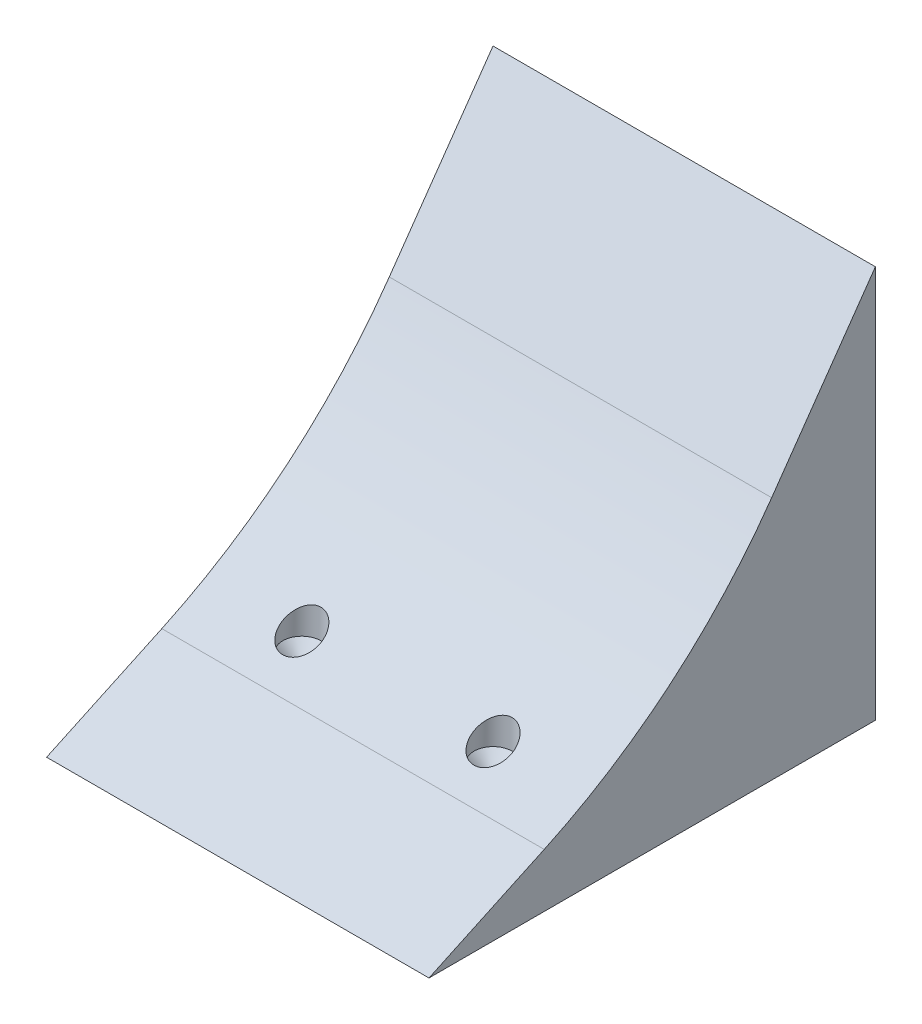
ISO-10303-21;
HEADER;
FILE_DESCRIPTION(('STEP AP214'),'2;1');
FILE_NAME('part.step','',(''),(''),'','','');
FILE_SCHEMA(('AUTOMOTIVE_DESIGN { 1 0 10303 214 1 1 1 1 }'));
ENDSEC;
DATA;
#1=APPLICATION_CONTEXT('core data for automotive mechanical design processes');
#2=APPLICATION_PROTOCOL_DEFINITION('international standard','automotive_design',2000,#1);
#3=PRODUCT_CONTEXT('',#1,'mechanical');
#4=PRODUCT('Part','Part','',(#3));
#5=PRODUCT_RELATED_PRODUCT_CATEGORY('part','',(#4));
#6=PRODUCT_DEFINITION_FORMATION('','',#4);
#7=PRODUCT_DEFINITION_CONTEXT('part definition',#1,'design');
#8=PRODUCT_DEFINITION('design','',#6,#7);
#9=PRODUCT_DEFINITION_SHAPE('','',#8);
#10=(LENGTH_UNIT() NAMED_UNIT(*) SI_UNIT(.MILLI.,.METRE.));
#11=(NAMED_UNIT(*) PLANE_ANGLE_UNIT() SI_UNIT($,.RADIAN.));
#12=(NAMED_UNIT(*) SI_UNIT($,.STERADIAN.) SOLID_ANGLE_UNIT());
#13=UNCERTAINTY_MEASURE_WITH_UNIT(LENGTH_MEASURE(1.E-05),#10,'distance_accuracy_value','');
#14=(GEOMETRIC_REPRESENTATION_CONTEXT(3) GLOBAL_UNCERTAINTY_ASSIGNED_CONTEXT((#13)) GLOBAL_UNIT_ASSIGNED_CONTEXT((#10,
#11,#12)) REPRESENTATION_CONTEXT('',''));
#15=CARTESIAN_POINT('',(0.,0.,0.));
#16=DIRECTION('',(0.,0.,1.));
#17=DIRECTION('',(1.,0.,0.));
#18=AXIS2_PLACEMENT_3D('',#15,#16,#17);
#19=CARTESIAN_POINT('',(101.6,28.0847994332052,95.2759098807705));
#20=DIRECTION('',(-1.,0.,0.));
#21=DIRECTION('',(0.,0.,1.));
#22=AXIS2_PLACEMENT_3D('',#19,#20,#21);
#23=CYLINDRICAL_SURFACE('',#22,152.4);
#24=CARTESIAN_POINT('',(25.4,-100.831148377762,13.9959098807705));
#25=CARTESIAN_POINT('',(25.527095889129,-100.831146925053,13.9959077338625));
#26=CARTESIAN_POINT('',(25.654168337019,-100.834158644722,14.0006838358532));
#27=CARTESIAN_POINT('',(25.9073590694925,-100.846155104622,14.0197156893053));
#28=CARTESIAN_POINT('',(26.0334771112958,-100.855141316184,14.0339737758832));
#29=CARTESIAN_POINT('',(26.283836827044,-100.878956948277,14.0717841490509));
#30=CARTESIAN_POINT('',(26.4080771234869,-100.893790461031,14.0953429447426));
#31=CARTESIAN_POINT('',(26.6537452936141,-100.929081379971,14.1514397468149));
#32=CARTESIAN_POINT('',(26.7751720152792,-100.949541047161,14.183981363177));
#33=CARTESIAN_POINT('',(27.0138567866955,-100.995694177725,14.25746728632));
#34=CARTESIAN_POINT('',(27.131130177653,-101.021365341579,14.2983757973141));
#35=CARTESIAN_POINT('',(27.3613661964323,-101.077653533963,14.3881879959891));
#36=CARTESIAN_POINT('',(27.4743271719837,-101.108272435132,14.4370947109454));
#37=CARTESIAN_POINT('',(27.8057171021053,-101.20697879356,14.5949859622279));
#38=CARTESIAN_POINT('',(28.0168808773068,-101.281960831124,14.715212926599));
#39=CARTESIAN_POINT('',(28.4280461076282,-101.452118847568,14.9890848863961));
#40=CARTESIAN_POINT('',(28.6265732442734,-101.548249939235,15.14432490556));
#41=CARTESIAN_POINT('',(28.994979443251,-101.753968029832,15.478084589699));
#42=CARTESIAN_POINT('',(29.1648463452128,-101.863560706527,15.6566140795798));
#43=CARTESIAN_POINT('',(29.4972552974629,-102.109801400589,16.0598164901569));
#44=CARTESIAN_POINT('',(29.6550534750942,-102.248058683302,16.287415042392));
#45=CARTESIAN_POINT('',(29.9300247530824,-102.533711225513,16.7606805266267));
#46=CARTESIAN_POINT('',(30.0471738840227,-102.681111816346,17.0063580160561));
#47=CARTESIAN_POINT('',(30.253604500292,-103.002199985407,17.545158059831));
#48=CARTESIAN_POINT('',(30.3367895530178,-103.17670334522,17.8401426625707));
#49=CARTESIAN_POINT('',(30.4491095191719,-103.52807821422,18.4388664160297));
#50=CARTESIAN_POINT('',(30.4782182043303,-103.704950830685,18.7426097424387));
#51=CARTESIAN_POINT('',(30.4817500527579,-104.070335474302,19.3751645021489));
#52=CARTESIAN_POINT('',(30.4518190194479,-104.25870270854,19.704115917925));
#53=CARTESIAN_POINT('',(30.3587965782812,-104.535346963207,20.1913434883379));
#54=CARTESIAN_POINT('',(30.3197252867779,-104.626637140789,20.3528267474143));
#55=CARTESIAN_POINT('',(30.2254602980328,-104.806594348569,20.6724853068499));
#56=CARTESIAN_POINT('',(30.1702744096019,-104.895262626422,20.8306621697331));
#57=CARTESIAN_POINT('',(30.0449888107755,-105.067586834879,21.139328429104));
#58=CARTESIAN_POINT('',(29.9751965952473,-105.15130639171,21.289907190589));
#59=CARTESIAN_POINT('',(29.8202071069377,-105.314788478739,21.5850801784497));
#60=CARTESIAN_POINT('',(29.735017451534,-105.394552940836,21.7296773207611));
#61=CARTESIAN_POINT('',(29.5494269040788,-105.549393350824,22.0114003504996));
#62=CARTESIAN_POINT('',(29.449029104856,-105.624470247636,22.1485277493315));
#63=CARTESIAN_POINT('',(29.2333784312333,-105.769151867417,22.4136938278648));
#64=CARTESIAN_POINT('',(29.1181277316201,-105.838757389117,22.5417338339095));
#65=CARTESIAN_POINT('',(28.8861977308859,-105.96470071235,22.7741366949434));
#66=CARTESIAN_POINT('',(28.7709345661399,-106.021664458877,22.87957457072));
#67=CARTESIAN_POINT('',(28.5295906201687,-106.129935819531,23.0804954625161));
#68=CARTESIAN_POINT('',(28.4035117424651,-106.181244425322,23.1759802237175));
#69=CARTESIAN_POINT('',(28.1414436089878,-106.277566746852,23.3556419242981));
#70=CARTESIAN_POINT('',(28.0054625785913,-106.322585598551,23.4398280874186));
#71=CARTESIAN_POINT('',(27.7245476747473,-106.405787411191,23.5957183080165));
#72=CARTESIAN_POINT('',(27.5796152363313,-106.443971464036,23.6674243592232));
#73=CARTESIAN_POINT('',(27.3020255813397,-106.508341667286,23.7884954641284));
#74=CARTESIAN_POINT('',(27.170323284551,-106.535449730123,23.8395663502029));
#75=CARTESIAN_POINT('',(26.9021600334595,-106.583823762432,23.930800751528));
#76=CARTESIAN_POINT('',(26.7656997623001,-106.605090566723,23.9709658254027));
#77=CARTESIAN_POINT('',(26.489194681394,-106.641516335707,24.0398139866264));
#78=CARTESIAN_POINT('',(26.3491518965172,-106.65667867298,24.068503413954));
#79=CARTESIAN_POINT('',(26.0666197076415,-106.680719699487,24.1140133385176));
#80=CARTESIAN_POINT('',(25.9241304692016,-106.689598812222,24.1308346356881));
#81=CARTESIAN_POINT('',(25.6517832283342,-106.700412191532,24.1513231133066));
#82=CARTESIAN_POINT('',(25.5220305883379,-106.702933028113,24.1561012735256));
#83=CARTESIAN_POINT('',(25.2624996487246,-106.702724851373,24.1557067107785));
#84=CARTESIAN_POINT('',(25.1327213540076,-106.699994174033,24.1505308337279));
#85=CARTESIAN_POINT('',(24.8742310494174,-106.689311550241,24.1302906315561));
#86=CARTESIAN_POINT('',(24.7455184768466,-106.681362564196,24.1152319130863));
#87=CARTESIAN_POINT('',(24.4899831888008,-106.660327697537,24.0754097397805));
#88=CARTESIAN_POINT('',(24.3631611949375,-106.647239905102,24.0506426730921));
#89=CARTESIAN_POINT('',(24.1152512561247,-106.616421918236,23.9923772382394));
#90=CARTESIAN_POINT('',(23.9940985312823,-106.598806076068,23.9590940218814));
#91=CARTESIAN_POINT('',(23.7552567389438,-106.558971301633,23.8839159013728));
#92=CARTESIAN_POINT('',(23.637568906134,-106.536750750657,23.8420179689005));
#93=CARTESIAN_POINT('',(23.2908674990325,-106.463481257388,23.7040504872464));
#94=CARTESIAN_POINT('',(23.0680007216941,-106.405797400563,23.5956558812597));
#95=CARTESIAN_POINT('',(22.6336154914208,-106.271562491855,23.3443509910213));
#96=CARTESIAN_POINT('',(22.4231669832966,-106.194233957897,23.200025085687));
#97=CARTESIAN_POINT('',(22.0296324690722,-106.024762347907,22.8851826802097));
#98=CARTESIAN_POINT('',(21.8465560283506,-105.932614116259,22.7146570663916));
#99=CARTESIAN_POINT('',(21.4935608707029,-105.726240562584,22.3347233176461));
#100=CARTESIAN_POINT('',(21.3267427347128,-105.610732472161,22.1231367592106));
#101=CARTESIAN_POINT('',(21.0308324072346,-105.367978027089,21.6812101002625));
#102=CARTESIAN_POINT('',(20.9017575556856,-105.240726312418,21.4508614420443));
#103=CARTESIAN_POINT('',(20.668659404381,-104.961374984458,20.9484747320168));
#104=CARTESIAN_POINT('',(20.5695871559883,-104.808135072699,20.6747723526757));
#105=CARTESIAN_POINT('',(20.4197888419949,-104.494329803347,20.1184971604444));
#106=CARTESIAN_POINT('',(20.3690864580135,-104.33376089779,19.8359200724041));
#107=CARTESIAN_POINT('',(20.312795382673,-103.991397013284,19.2379646288701));
#108=CARTESIAN_POINT('',(20.3126184631802,-103.809170164582,18.9223137988873));
#109=CARTESIAN_POINT('',(20.3703313474237,-103.44477642041,18.296288093648));
#110=CARTESIAN_POINT('',(20.4282459760731,-103.262609583877,17.9859155316789));
#111=CARTESIAN_POINT('',(20.6057426696881,-102.894687698444,17.3639719327081));
#112=CARTESIAN_POINT('',(20.7280940284502,-102.709166135186,17.053029612108));
#113=CARTESIAN_POINT('',(20.9580612678788,-102.44001769135,16.6053126686959));
#114=CARTESIAN_POINT('',(21.0425404640378,-102.351759093106,16.4590838527897));
#115=CARTESIAN_POINT('',(21.2268441514676,-102.17919264564,16.1742033854583));
#116=CARTESIAN_POINT('',(21.326659833985,-102.094882564568,16.0355474460092));
#117=CARTESIAN_POINT('',(21.5357955240347,-101.935470541522,15.7742644671224));
#118=CARTESIAN_POINT('',(21.6443517984416,-101.860117759509,15.6511788824258));
#119=CARTESIAN_POINT('',(21.8746159565168,-101.714847119835,15.4145863020849));
#120=CARTESIAN_POINT('',(21.9963158803209,-101.644926016347,15.3010735824261));
#121=CARTESIAN_POINT('',(22.2522132264698,-101.511592789354,15.0851921628838));
#122=CARTESIAN_POINT('',(22.3863944909175,-101.44817246784,14.9828094170838));
#123=CARTESIAN_POINT('',(22.6665700638313,-101.328852173077,14.7906343912239));
#124=CARTESIAN_POINT('',(22.8125592330218,-101.272948955992,14.7008366796625));
#125=CARTESIAN_POINT('',(23.0724696871111,-101.184346841174,14.5587944660248));
#126=CARTESIAN_POINT('',(23.1838110467079,-101.149552198523,14.5031045325393));
#127=CARTESIAN_POINT('',(23.4114509556421,-101.084815110437,14.3996191447956));
#128=CARTESIAN_POINT('',(23.5277483769181,-101.054871568202,14.3518219060088));
#129=CARTESIAN_POINT('',(23.7644833422491,-101.000261020421,14.2647389841772));
#130=CARTESIAN_POINT('',(23.8849142053123,-100.975585926156,14.2254402520517));
#131=CARTESIAN_POINT('',(24.1292828592441,-100.93180350236,14.155765301408));
#132=CARTESIAN_POINT('',(24.2532198539525,-100.912694919765,14.1253870748016));
#133=CARTESIAN_POINT('',(24.5455083190916,-100.874937058407,14.0653931109467));
#134=CARTESIAN_POINT('',(24.7149161589382,-100.858556338521,14.0393946061975));
#135=CARTESIAN_POINT('',(25.056229994743,-100.836662015205,14.0046529100892));
#136=CARTESIAN_POINT('',(25.2281364290025,-100.831150342167,13.9959127838957));
#137=CARTESIAN_POINT('',(25.4,-100.831148377762,13.9959098807705));
#138=B_SPLINE_CURVE_WITH_KNOTS('',3,(#24,#25,#26,#27,#28,#29,#30,#31,#32,#33,#34,#35,#36,#37,
#38,#39,#40,#41,#42,#43,#44,#45,#46,#47,#48,#49,#50,#51,#52,#53,#54,#55,#56,#57,#58,#59,#60,#61,
#62,#63,#64,#65,#66,#67,#68,#69,#70,#71,#72,#73,#74,#75,#76,#77,#78,#79,#80,#81,#82,#83,#84,#85,
#86,#87,#88,#89,#90,#91,#92,#93,#94,#95,#96,#97,#98,#99,#100,#101,#102,#103,#104,#105,#106,#107,
#108,#109,#110,#111,#112,#113,#114,#115,#116,#117,#118,#119,#120,#121,#122,#123,#124,#125,#126,
#127,#128,#129,#130,#131,#132,#133,#134,#135,#136,#137),.UNSPECIFIED.,.T.,.F.,(4,2,2,2,2,2,2,2,
2,2,2,2,2,2,2,2,2,2,2,2,2,2,2,2,2,2,2,2,2,2,2,2,2,2,2,2,2,2,2,2,2,2,2,2,2,2,2,2,2,2,2,2,2,2,2,2,
4),(0.,0.381122593250436,0.76233907985687,1.14382283515143,1.52546012342961,1.90549759438693,
2.28567924172155,3.04532221084819,3.85146114313089,4.65794125997346,5.58292416915991,
6.5084515873642,7.56200460978077,8.6160684961338,9.75077544998315,10.3188994645731,
10.8867486332169,11.4436682393201,12.0003130781339,12.5568448655749,13.1132952570846,
13.6114162539816,14.1094497627562,14.6070741903823,15.1046190481407,15.5355417520118,
15.9664028373151,16.3970255538611,16.8276192428423,17.2167366037732,17.605977282631,
17.9949973313668,18.384162247033,18.7643278862046,19.1446273937659,19.9045652911706,
20.701252021411,21.4982165124507,22.3741390922668,23.2504634565845,24.2332900054288,
25.2165974941665,26.3051911842383,27.3942502735422,28.53447301402,29.1054689836457,
29.6761382102972,30.217143927625,30.7578238269598,31.2978132724979,31.8375689446993,
32.2249694724501,32.6122822891201,32.9989961137966,33.3856228187686,33.9008988055478,
34.4162662994357),.UNSPECIFIED.);
#139=CARTESIAN_POINT('',(25.4,-100.831148377762,13.9959098807705));
#140=VERTEX_POINT('',#139);
#141=EDGE_CURVE('E163',#140,#140,#138,.T.);
#142=ORIENTED_EDGE('',*,*,#141,.T.);
#143=EDGE_LOOP('',(#142));
#144=FACE_BOUND('',#143,.T.);
#145=CARTESIAN_POINT('',(76.2,-100.831148377762,13.9959098807705));
#146=CARTESIAN_POINT('',(76.327095889129,-100.831146925053,13.9959077338625));
#147=CARTESIAN_POINT('',(76.454168337019,-100.834158644722,14.0006838358532));
#148=CARTESIAN_POINT('',(76.7073590694925,-100.846155104622,14.0197156893053));
#149=CARTESIAN_POINT('',(76.8334771112958,-100.855141316184,14.0339737758832));
#150=CARTESIAN_POINT('',(77.083836827044,-100.878956948277,14.0717841490509));
#151=CARTESIAN_POINT('',(77.2080771234869,-100.893790461031,14.0953429447426));
#152=CARTESIAN_POINT('',(77.4537452936141,-100.929081379971,14.1514397468149));
#153=CARTESIAN_POINT('',(77.5751720152792,-100.94954104716,14.1839813631769));
#154=CARTESIAN_POINT('',(77.8138567866955,-100.995694177725,14.25746728632));
#155=CARTESIAN_POINT('',(77.931130177653,-101.021365341579,14.2983757973141));
#156=CARTESIAN_POINT('',(78.1613661964323,-101.077653533963,14.3881879959891));
#157=CARTESIAN_POINT('',(78.2743271719837,-101.108272435132,14.4370947109454));
#158=CARTESIAN_POINT('',(78.6057171021053,-101.206978793559,14.5949859622279));
#159=CARTESIAN_POINT('',(78.8168808773068,-101.281960831124,14.7152129265991));
#160=CARTESIAN_POINT('',(79.2280461076282,-101.452118847568,14.9890848863961));
#161=CARTESIAN_POINT('',(79.4265732442734,-101.548249939235,15.14432490556));
#162=CARTESIAN_POINT('',(79.794979443251,-101.753968029832,15.478084589699));
#163=CARTESIAN_POINT('',(79.9648463452128,-101.863560706527,15.6566140795798));
#164=CARTESIAN_POINT('',(80.2972552974629,-102.109801400589,16.0598164901569));
#165=CARTESIAN_POINT('',(80.4550534750942,-102.248058683302,16.287415042392));
#166=CARTESIAN_POINT('',(80.7300247530824,-102.533711225513,16.7606805266267));
#167=CARTESIAN_POINT('',(80.8471738840227,-102.681111816346,17.0063580160561));
#168=CARTESIAN_POINT('',(81.053604500292,-103.002199985407,17.545158059831));
#169=CARTESIAN_POINT('',(81.1367895530178,-103.17670334522,17.8401426625707));
#170=CARTESIAN_POINT('',(81.2491095191719,-103.52807821422,18.4388664160298));
#171=CARTESIAN_POINT('',(81.2782182043303,-103.704950830685,18.7426097424387));
#172=CARTESIAN_POINT('',(81.2817500527579,-104.070335474302,19.3751645021489));
#173=CARTESIAN_POINT('',(81.2518190194479,-104.25870270854,19.704115917925));
#174=CARTESIAN_POINT('',(81.1587965782812,-104.535346963207,20.1913434883379));
#175=CARTESIAN_POINT('',(81.1197252867779,-104.626637140789,20.3528267474144));
#176=CARTESIAN_POINT('',(81.0254602980328,-104.806594348569,20.6724853068499));
#177=CARTESIAN_POINT('',(80.9702744096019,-104.895262626422,20.8306621697331));
#178=CARTESIAN_POINT('',(80.8449888107755,-105.067586834879,21.139328429104));
#179=CARTESIAN_POINT('',(80.7751965952473,-105.15130639171,21.289907190589));
#180=CARTESIAN_POINT('',(80.6202071069377,-105.314788478739,21.5850801784497));
#181=CARTESIAN_POINT('',(80.535017451534,-105.394552940836,21.729677320761));
#182=CARTESIAN_POINT('',(80.3494269040788,-105.549393350824,22.0114003504996));
#183=CARTESIAN_POINT('',(80.249029104856,-105.624470247636,22.1485277493315));
#184=CARTESIAN_POINT('',(80.0333784312333,-105.769151867417,22.4136938278648));
#185=CARTESIAN_POINT('',(79.9181277316201,-105.838757389117,22.5417338339095));
#186=CARTESIAN_POINT('',(79.6861977308859,-105.96470071235,22.7741366949434));
#187=CARTESIAN_POINT('',(79.5709345661399,-106.021664458877,22.87957457072));
#188=CARTESIAN_POINT('',(79.3295906201687,-106.129935819531,23.0804954625161));
#189=CARTESIAN_POINT('',(79.2035117424651,-106.181244425322,23.1759802237175));
#190=CARTESIAN_POINT('',(78.9414436089878,-106.277566746852,23.3556419242981));
#191=CARTESIAN_POINT('',(78.8054625785913,-106.322585598551,23.4398280874186));
#192=CARTESIAN_POINT('',(78.5245476747473,-106.405787411191,23.5957183080165));
#193=CARTESIAN_POINT('',(78.3796152363312,-106.443971464036,23.6674243592232));
#194=CARTESIAN_POINT('',(78.1020255813397,-106.508341667286,23.7884954641284));
#195=CARTESIAN_POINT('',(77.970323284551,-106.535449730123,23.839566350203));
#196=CARTESIAN_POINT('',(77.7021600334594,-106.583823762432,23.930800751528));
#197=CARTESIAN_POINT('',(77.5656997623001,-106.605090566723,23.9709658254027));
#198=CARTESIAN_POINT('',(77.289194681394,-106.641516335707,24.0398139866264));
#199=CARTESIAN_POINT('',(77.1491518965172,-106.65667867298,24.068503413954));
#200=CARTESIAN_POINT('',(76.8666197076415,-106.680719699487,24.1140133385176));
#201=CARTESIAN_POINT('',(76.7241304692015,-106.689598812222,24.1308346356881));
#202=CARTESIAN_POINT('',(76.4517832283342,-106.700412191532,24.1513231133066));
#203=CARTESIAN_POINT('',(76.3220305883379,-106.702933028113,24.1561012735256));
#204=CARTESIAN_POINT('',(76.0624996487246,-106.702724851373,24.1557067107785));
#205=CARTESIAN_POINT('',(75.9327213540076,-106.699994174033,24.1505308337279));
#206=CARTESIAN_POINT('',(75.6742310494174,-106.689311550241,24.1302906315561));
#207=CARTESIAN_POINT('',(75.5455184768466,-106.681362564196,24.1152319130863));
#208=CARTESIAN_POINT('',(75.2899831888008,-106.660327697537,24.0754097397805));
#209=CARTESIAN_POINT('',(75.1631611949374,-106.647239905102,24.0506426730921));
#210=CARTESIAN_POINT('',(74.9152512561247,-106.616421918236,23.9923772382394));
#211=CARTESIAN_POINT('',(74.7940985312823,-106.598806076068,23.9590940218814));
#212=CARTESIAN_POINT('',(74.5552567389438,-106.558971301633,23.8839159013728));
#213=CARTESIAN_POINT('',(74.437568906134,-106.536750750657,23.8420179689005));
#214=CARTESIAN_POINT('',(74.0908674990325,-106.463481257388,23.7040504872464));
#215=CARTESIAN_POINT('',(73.8680007216941,-106.405797400563,23.5956558812597));
#216=CARTESIAN_POINT('',(73.4336154914208,-106.271562491855,23.3443509910213));
#217=CARTESIAN_POINT('',(73.2231669832966,-106.194233957897,23.200025085687));
#218=CARTESIAN_POINT('',(72.8296324690722,-106.024762347907,22.8851826802097));
#219=CARTESIAN_POINT('',(72.6465560283506,-105.932614116259,22.7146570663916));
#220=CARTESIAN_POINT('',(72.2935608707029,-105.726240562584,22.3347233176461));
#221=CARTESIAN_POINT('',(72.1267427347128,-105.610732472161,22.1231367592106));
#222=CARTESIAN_POINT('',(71.8308324072346,-105.367978027089,21.6812101002625));
#223=CARTESIAN_POINT('',(71.7017575556856,-105.240726312418,21.4508614420443));
#224=CARTESIAN_POINT('',(71.468659404381,-104.961374984458,20.9484747320168));
#225=CARTESIAN_POINT('',(71.3695871559883,-104.808135072699,20.6747723526757));
#226=CARTESIAN_POINT('',(71.2197888419949,-104.494329803347,20.1184971604443));
#227=CARTESIAN_POINT('',(71.1690864580135,-104.33376089779,19.8359200724041));
#228=CARTESIAN_POINT('',(71.112795382673,-103.991397013284,19.2379646288701));
#229=CARTESIAN_POINT('',(71.1126184631802,-103.809170164582,18.9223137988873));
#230=CARTESIAN_POINT('',(71.1703313474237,-103.44477642041,18.296288093648));
#231=CARTESIAN_POINT('',(71.2282459760731,-103.262609583877,17.9859155316789));
#232=CARTESIAN_POINT('',(71.4057426696881,-102.894687698444,17.3639719327081));
#233=CARTESIAN_POINT('',(71.5280940284502,-102.709166135186,17.053029612108));
#234=CARTESIAN_POINT('',(71.7580612678788,-102.44001769135,16.6053126686959));
#235=CARTESIAN_POINT('',(71.8425404640378,-102.351759093106,16.4590838527897));
#236=CARTESIAN_POINT('',(72.0268441514676,-102.17919264564,16.1742033854583));
#237=CARTESIAN_POINT('',(72.126659833985,-102.094882564568,16.0355474460092));
#238=CARTESIAN_POINT('',(72.3357955240347,-101.935470541522,15.7742644671224));
#239=CARTESIAN_POINT('',(72.4443517984416,-101.860117759509,15.6511788824258));
#240=CARTESIAN_POINT('',(72.6746159565168,-101.714847119835,15.4145863020849));
#241=CARTESIAN_POINT('',(72.7963158803209,-101.644926016347,15.3010735824261));
#242=CARTESIAN_POINT('',(73.0522132264698,-101.511592789354,15.0851921628838));
#243=CARTESIAN_POINT('',(73.1863944909175,-101.44817246784,14.9828094170838));
#244=CARTESIAN_POINT('',(73.4665700638313,-101.328852173077,14.7906343912239));
#245=CARTESIAN_POINT('',(73.6125592330218,-101.272948955992,14.7008366796625));
#246=CARTESIAN_POINT('',(73.8724696871111,-101.184346841174,14.5587944660248));
#247=CARTESIAN_POINT('',(73.9838110467079,-101.149552198523,14.5031045325393));
#248=CARTESIAN_POINT('',(74.2114509556421,-101.084815110437,14.3996191447956));
#249=CARTESIAN_POINT('',(74.327748376918,-101.054871568202,14.3518219060088));
#250=CARTESIAN_POINT('',(74.5644833422491,-101.000261020421,14.2647389841772));
#251=CARTESIAN_POINT('',(74.6849142053123,-100.975585926156,14.2254402520517));
#252=CARTESIAN_POINT('',(74.9292828592441,-100.93180350236,14.155765301408));
#253=CARTESIAN_POINT('',(75.0532198539525,-100.912694919765,14.1253870748016));
#254=CARTESIAN_POINT('',(75.3455083190916,-100.874937058407,14.0653931109467));
#255=CARTESIAN_POINT('',(75.5149161589382,-100.858556338521,14.0393946061975));
#256=CARTESIAN_POINT('',(75.856229994743,-100.836662015205,14.0046529100892));
#257=CARTESIAN_POINT('',(76.0281364290025,-100.831150342167,13.9959127838957));
#258=CARTESIAN_POINT('',(76.2,-100.831148377762,13.9959098807705));
#259=B_SPLINE_CURVE_WITH_KNOTS('',3,(#145,#146,#147,#148,#149,#150,#151,#152,#153,#154,#155,
#156,#157,#158,#159,#160,#161,#162,#163,#164,#165,#166,#167,#168,#169,#170,#171,#172,#173,#174,
#175,#176,#177,#178,#179,#180,#181,#182,#183,#184,#185,#186,#187,#188,#189,#190,#191,#192,#193,
#194,#195,#196,#197,#198,#199,#200,#201,#202,#203,#204,#205,#206,#207,#208,#209,#210,#211,#212,
#213,#214,#215,#216,#217,#218,#219,#220,#221,#222,#223,#224,#225,#226,#227,#228,#229,#230,#231,
#232,#233,#234,#235,#236,#237,#238,#239,#240,#241,#242,#243,#244,#245,#246,#247,#248,#249,#250,
#251,#252,#253,#254,#255,#256,#257,#258),.UNSPECIFIED.,.T.,.F.,(4,2,2,2,2,2,2,2,2,2,2,2,2,2,2,2,
2,2,2,2,2,2,2,2,2,2,2,2,2,2,2,2,2,2,2,2,2,2,2,2,2,2,2,2,2,2,2,2,2,2,2,2,2,2,2,2,4),(0.,
0.381122593250446,0.762339079856873,1.14382283515142,1.52546012342961,1.90549759438695,
2.28567924172159,3.0453222108482,3.8514611431309,4.65794125997345,5.58292416915991,
6.50845158736421,7.56200460978078,8.6160684961338,9.75077544998317,10.3188994645731,
10.886748633217,11.4436682393201,12.0003130781339,12.5568448655749,13.1132952570846,
13.6114162539816,14.1094497627562,14.6070741903823,15.1046190481408,15.5355417520118,
15.9664028373151,16.3970255538611,16.8276192428423,17.2167366037732,17.605977282631,
17.9949973313668,18.384162247033,18.7643278862046,19.144627393766,19.9045652911706,
20.701252021411,21.4982165124508,22.3741390922668,23.2504634565845,24.2332900054289,
25.2165974941665,26.3051911842383,27.3942502735422,28.5344730140201,29.1054689836457,
29.6761382102972,30.217143927625,30.7578238269598,31.297813272498,31.8375689446993,
32.2249694724501,32.6122822891201,32.9989961137966,33.3856228187687,33.9008988055478,
34.4162662994357),.UNSPECIFIED.);
#260=CARTESIAN_POINT('',(76.2,-100.831148377762,13.9959098807705));
#261=VERTEX_POINT('',#260);
#262=EDGE_CURVE('E154',#261,#261,#259,.T.);
#263=ORIENTED_EDGE('',*,*,#262,.T.);
#264=EDGE_LOOP('',(#263));
#265=FACE_BOUND('',#264,.T.);
#266=CARTESIAN_POINT('',(0.,28.0847994332052,95.2759098807705));
#267=DIRECTION('',(-1.,0.,0.));
#268=DIRECTION('',(0.,0.,-1.));
#269=AXIS2_PLACEMENT_3D('',#266,#267,#268);
#270=CIRCLE('',#269,152.4);
#271=CARTESIAN_POINT('',(0.,-59.3282494666939,-29.5628616688721));
#272=VERTEX_POINT('',#271);
#273=CARTESIAN_POINT('',(0.,-110.036507311181,30.8688867914888));
#274=VERTEX_POINT('',#273);
#275=EDGE_CURVE('E121',#272,#274,#270,.T.);
#276=ORIENTED_EDGE('',*,*,#275,.T.);
#277=DIRECTION('',(-1.,0.,0.));
#278=VECTOR('',#277,1.);
#279=CARTESIAN_POINT('',(101.6,-110.036507311181,30.8688867914888));
#280=LINE('',#279,#278);
#281=CARTESIAN_POINT('',(101.6,-110.036507311181,30.8688867914888));
#282=VERTEX_POINT('',#281);
#283=EDGE_CURVE('E142',#282,#274,#280,.T.);
#284=ORIENTED_EDGE('',*,*,#283,.F.);
#285=CARTESIAN_POINT('',(101.6,28.0847994332052,95.2759098807705));
#286=DIRECTION('',(-1.,0.,0.));
#287=DIRECTION('',(0.,0.,-1.));
#288=AXIS2_PLACEMENT_3D('',#285,#286,#287);
#289=CIRCLE('',#288,152.4);
#290=CARTESIAN_POINT('',(101.6,-59.3282494666939,-29.5628616688721));
#291=VERTEX_POINT('',#290);
#292=EDGE_CURVE('E135',#291,#282,#289,.T.);
#293=ORIENTED_EDGE('',*,*,#292,.F.);
#294=DIRECTION('',(-1.,0.,0.));
#295=VECTOR('',#294,1.);
#296=CARTESIAN_POINT('',(101.6,-59.3282494666939,-29.5628616688721));
#297=LINE('',#296,#295);
#298=EDGE_CURVE('E117',#291,#272,#297,.T.);
#299=ORIENTED_EDGE('',*,*,#298,.T.);
#300=EDGE_LOOP('',(#276,#284,#293,#299));
#301=FACE_BOUND('',#300,.T.);
#302=ADVANCED_FACE('F39',(#144,#265,#301),#23,.F.);
#303=CARTESIAN_POINT('',(101.6,-110.036507311181,30.8688867914888));
#304=DIRECTION('',(0.,-0.906307787036653,-0.422618261740694));
#305=DIRECTION('',(0.,0.422618261740694,-0.906307787036653));
#306=AXIS2_PLACEMENT_3D('',#303,#304,#305);
#307=PLANE('',#306);
#308=DIRECTION('',(0.,-0.422618261740694,0.906307787036653));
#309=VECTOR('',#308,1.);
#310=CARTESIAN_POINT('',(0.,-110.036507311181,30.8688867914888));
#311=LINE('',#310,#309);
#312=CARTESIAN_POINT('',(0.,-124.315200566795,61.489643293987));
#313=VERTEX_POINT('',#312);
#314=EDGE_CURVE('E125',#274,#313,#311,.T.);
#315=ORIENTED_EDGE('',*,*,#314,.T.);
#316=DIRECTION('',(-1.,0.,0.));
#317=VECTOR('',#316,1.);
#318=CARTESIAN_POINT('',(101.6,-124.315200566795,61.489643293987));
#319=LINE('',#318,#317);
#320=CARTESIAN_POINT('',(101.6,-124.315200566795,61.489643293987));
#321=VERTEX_POINT('',#320);
#322=EDGE_CURVE('E110',#321,#313,#319,.T.);
#323=ORIENTED_EDGE('',*,*,#322,.F.);
#324=DIRECTION('',(0.,-0.422618261740694,0.906307787036653));
#325=VECTOR('',#324,1.);
#326=CARTESIAN_POINT('',(101.6,-110.036507311181,30.8688867914888));
#327=LINE('',#326,#325);
#328=EDGE_CURVE('E92',#282,#321,#327,.T.);
#329=ORIENTED_EDGE('',*,*,#328,.F.);
#330=ORIENTED_EDGE('',*,*,#283,.T.);
#331=EDGE_LOOP('',(#315,#323,#329,#330));
#332=FACE_BOUND('',#331,.T.);
#333=ADVANCED_FACE('F200',(#332),#307,.F.);
#334=CARTESIAN_POINT('',(101.6,-124.315200566795,61.489643293987));
#335=DIRECTION('',(0.,1.,0.));
#336=DIRECTION('',(0.,0.,1.));
#337=AXIS2_PLACEMENT_3D('',#334,#335,#336);
#338=PLANE('',#337);
#339=CARTESIAN_POINT('',(25.4,-124.315200566795,19.0759098807705));
#340=DIRECTION('',(0.,-1.,0.));
#341=DIRECTION('',(0.,0.,-1.));
#342=AXIS2_PLACEMENT_3D('',#339,#340,#341);
#343=CIRCLE('',#342,1.905);
#344=CARTESIAN_POINT('',(25.4,-124.315200566795,17.1709098807705));
#345=VERTEX_POINT('',#344);
#346=EDGE_CURVE('E126',#345,#345,#343,.T.);
#347=ORIENTED_EDGE('',*,*,#346,.F.);
#348=EDGE_LOOP('',(#347));
#349=FACE_BOUND('',#348,.T.);
#350=CARTESIAN_POINT('',(76.2,-124.315200566795,19.0759098807705));
#351=DIRECTION('',(0.,-1.,0.));
#352=DIRECTION('',(0.,0.,-1.));
#353=AXIS2_PLACEMENT_3D('',#350,#351,#352);
#354=CIRCLE('',#353,1.90500000000001);
#355=CARTESIAN_POINT('',(76.2,-124.315200566795,17.1709098807705));
#356=VERTEX_POINT('',#355);
#357=EDGE_CURVE('E215',#356,#356,#354,.T.);
#358=ORIENTED_EDGE('',*,*,#357,.F.);
#359=EDGE_LOOP('',(#358));
#360=FACE_BOUND('',#359,.T.);
#361=DIRECTION('',(0.,0.,-1.));
#362=VECTOR('',#361,1.);
#363=CARTESIAN_POINT('',(0.,-124.315200566795,61.489643293987));
#364=LINE('',#363,#362);
#365=CARTESIAN_POINT('',(0.,-124.315200566795,-57.1240901192295));
#366=VERTEX_POINT('',#365);
#367=EDGE_CURVE('E108',#313,#366,#364,.T.);
#368=ORIENTED_EDGE('',*,*,#367,.T.);
#369=DIRECTION('',(-1.,0.,0.));
#370=VECTOR('',#369,1.);
#371=CARTESIAN_POINT('',(101.6,-124.315200566795,-57.1240901192295));
#372=LINE('',#371,#370);
#373=CARTESIAN_POINT('',(101.6,-124.315200566795,-57.1240901192295));
#374=VERTEX_POINT('',#373);
#375=EDGE_CURVE('E105',#374,#366,#372,.T.);
#376=ORIENTED_EDGE('',*,*,#375,.F.);
#377=DIRECTION('',(0.,0.,-1.));
#378=VECTOR('',#377,1.);
#379=CARTESIAN_POINT('',(101.6,-124.315200566795,61.489643293987));
#380=LINE('',#379,#378);
#381=EDGE_CURVE('E96',#321,#374,#380,.T.);
#382=ORIENTED_EDGE('',*,*,#381,.F.);
#383=ORIENTED_EDGE('',*,*,#322,.T.);
#384=EDGE_LOOP('',(#368,#376,#382,#383));
#385=FACE_BOUND('',#384,.T.);
#386=ADVANCED_FACE('F106',(#349,#360,#385),#338,.F.);
#387=CARTESIAN_POINT('',(101.6,-124.315200566795,-57.1240901192295));
#388=DIRECTION('',(0.,0.,1.));
#389=DIRECTION('',(0.,-1.,0.));
#390=AXIS2_PLACEMENT_3D('',#387,#388,#389);
#391=PLANE('',#390);
#392=DIRECTION('',(0.,1.,0.));
#393=VECTOR('',#392,1.);
#394=CARTESIAN_POINT('',(0.,-124.315200566795,-57.1240901192295));
#395=LINE('',#394,#393);
#396=CARTESIAN_POINT('',(0.,-19.9667359919517,-57.1240901192295));
#397=VERTEX_POINT('',#396);
#398=EDGE_CURVE('E77',#366,#397,#395,.T.);
#399=ORIENTED_EDGE('',*,*,#398,.T.);
#400=DIRECTION('',(-1.,0.,0.));
#401=VECTOR('',#400,1.);
#402=CARTESIAN_POINT('',(101.6,-19.9667359919517,-57.1240901192295));
#403=LINE('',#402,#401);
#404=CARTESIAN_POINT('',(101.6,-19.9667359919517,-57.1240901192295));
#405=VERTEX_POINT('',#404);
#406=EDGE_CURVE('E111',#405,#397,#403,.T.);
#407=ORIENTED_EDGE('',*,*,#406,.F.);
#408=DIRECTION('',(0.,1.,0.));
#409=VECTOR('',#408,1.);
#410=CARTESIAN_POINT('',(101.6,-124.315200566795,-57.1240901192295));
#411=LINE('',#410,#409);
#412=EDGE_CURVE('E100',#374,#405,#411,.T.);
#413=ORIENTED_EDGE('',*,*,#412,.F.);
#414=ORIENTED_EDGE('',*,*,#375,.T.);
#415=EDGE_LOOP('',(#399,#407,#413,#414));
#416=FACE_BOUND('',#415,.T.);
#417=ADVANCED_FACE('F113',(#416),#391,.F.);
#418=CARTESIAN_POINT('',(101.6,-59.3282494666939,-29.5628616688721));
#419=DIRECTION('',(0.,-0.573576436351044,-0.819152044288993));
#420=DIRECTION('',(0.,0.819152044288993,-0.573576436351044));
#421=AXIS2_PLACEMENT_3D('',#418,#419,#420);
#422=PLANE('',#421);
#423=DIRECTION('',(0.,-0.819152044288993,0.573576436351044));
#424=VECTOR('',#423,1.);
#425=CARTESIAN_POINT('',(0.,-59.3282494666939,-29.5628616688721));
#426=LINE('',#425,#424);
#427=EDGE_CURVE('E83',#397,#272,#426,.T.);
#428=ORIENTED_EDGE('',*,*,#427,.T.);
#429=ORIENTED_EDGE('',*,*,#298,.F.);
#430=DIRECTION('',(0.,-0.819152044288993,0.573576436351044));
#431=VECTOR('',#430,1.);
#432=CARTESIAN_POINT('',(101.6,-59.3282494666939,-29.5628616688721));
#433=LINE('',#432,#431);
#434=EDGE_CURVE('E57',#405,#291,#433,.T.);
#435=ORIENTED_EDGE('',*,*,#434,.F.);
#436=ORIENTED_EDGE('',*,*,#406,.T.);
#437=EDGE_LOOP('',(#428,#429,#435,#436));
#438=FACE_BOUND('',#437,.T.);
#439=ADVANCED_FACE('F191',(#438),#422,.F.);
#440=CARTESIAN_POINT('',(101.6,28.0847994332052,95.2759098807705));
#441=DIRECTION('',(1.,0.,0.));
#442=DIRECTION('',(0.,0.,-1.));
#443=AXIS2_PLACEMENT_3D('',#440,#441,#442);
#444=PLANE('',#443);
#445=ORIENTED_EDGE('',*,*,#292,.T.);
#446=ORIENTED_EDGE('',*,*,#328,.T.);
#447=ORIENTED_EDGE('',*,*,#381,.T.);
#448=ORIENTED_EDGE('',*,*,#412,.T.);
#449=ORIENTED_EDGE('',*,*,#434,.T.);
#450=EDGE_LOOP('',(#445,#446,#447,#448,#449));
#451=FACE_BOUND('',#450,.T.);
#452=ADVANCED_FACE('F98',(#451),#444,.T.);
#453=CARTESIAN_POINT('',(0.,28.0847994332052,95.2759098807705));
#454=DIRECTION('',(1.,0.,0.));
#455=DIRECTION('',(0.,0.,-1.));
#456=AXIS2_PLACEMENT_3D('',#453,#454,#455);
#457=PLANE('',#456);
#458=ORIENTED_EDGE('',*,*,#275,.F.);
#459=ORIENTED_EDGE('',*,*,#427,.F.);
#460=ORIENTED_EDGE('',*,*,#398,.F.);
#461=ORIENTED_EDGE('',*,*,#367,.F.);
#462=ORIENTED_EDGE('',*,*,#314,.F.);
#463=EDGE_LOOP('',(#458,#459,#460,#461,#462));
#464=FACE_BOUND('',#463,.T.);
#465=ADVANCED_FACE('F187',(#464),#457,.F.);
#466=CARTESIAN_POINT('',(76.2,-22.7152005667948,19.0759098807705));
#467=DIRECTION('',(0.,-1.,0.));
#468=DIRECTION('',(0.,0.,-1.));
#469=AXIS2_PLACEMENT_3D('',#466,#467,#468);
#470=CYLINDRICAL_SURFACE('',#469,1.90500000000001);
#471=CARTESIAN_POINT('',(76.2,-111.615200566795,19.0759098807705));
#472=DIRECTION('',(0.,-1.,0.));
#473=DIRECTION('',(0.,0.,-1.));
#474=AXIS2_PLACEMENT_3D('',#471,#472,#473);
#475=CIRCLE('',#474,1.90500000000001);
#476=CARTESIAN_POINT('',(76.2,-111.615200566795,17.1709098807705));
#477=VERTEX_POINT('',#476);
#478=EDGE_CURVE('E150',#477,#477,#475,.F.);
#479=ORIENTED_EDGE('',*,*,#478,.T.);
#480=EDGE_LOOP('',(#479));
#481=FACE_BOUND('',#480,.T.);
#482=ORIENTED_EDGE('',*,*,#357,.T.);
#483=EDGE_LOOP('',(#482));
#484=FACE_BOUND('',#483,.T.);
#485=ADVANCED_FACE('F183',(#481,#484),#470,.F.);
#486=CARTESIAN_POINT('',(25.4,-22.7152005667948,19.0759098807705));
#487=DIRECTION('',(0.,-1.,0.));
#488=DIRECTION('',(0.,0.,-1.));
#489=AXIS2_PLACEMENT_3D('',#486,#487,#488);
#490=CYLINDRICAL_SURFACE('',#489,1.905);
#491=CARTESIAN_POINT('',(25.4,-111.615200566795,19.0759098807705));
#492=DIRECTION('',(0.,-1.,0.));
#493=DIRECTION('',(0.,0.,-1.));
#494=AXIS2_PLACEMENT_3D('',#491,#492,#493);
#495=CIRCLE('',#494,1.905);
#496=CARTESIAN_POINT('',(25.4,-111.615200566795,17.1709098807705));
#497=VERTEX_POINT('',#496);
#498=EDGE_CURVE('E146',#497,#497,#495,.F.);
#499=ORIENTED_EDGE('',*,*,#498,.T.);
#500=EDGE_LOOP('',(#499));
#501=FACE_BOUND('',#500,.T.);
#502=ORIENTED_EDGE('',*,*,#346,.T.);
#503=EDGE_LOOP('',(#502));
#504=FACE_BOUND('',#503,.T.);
#505=ADVANCED_FACE('F179',(#501,#504),#490,.F.);
#506=CARTESIAN_POINT('',(25.4,-10.0152005667948,19.0759098807705));
#507=DIRECTION('',(0.,-1.,0.));
#508=DIRECTION('',(0.,0.,-1.));
#509=AXIS2_PLACEMENT_3D('',#506,#507,#508);
#510=CYLINDRICAL_SURFACE('',#509,5.08);
#511=CARTESIAN_POINT('',(25.4,-108.567200566795,19.0759098807705));
#512=DIRECTION('',(0.,-1.,0.));
#513=DIRECTION('',(0.,0.,-1.));
#514=AXIS2_PLACEMENT_3D('',#511,#512,#513);
#515=CIRCLE('',#514,5.08);
#516=CARTESIAN_POINT('',(25.4,-108.567200566795,13.9959098807705));
#517=VERTEX_POINT('',#516);
#518=EDGE_CURVE('E49',#517,#517,#515,.T.);
#519=ORIENTED_EDGE('',*,*,#518,.T.);
#520=EDGE_LOOP('',(#519));
#521=FACE_BOUND('',#520,.T.);
#522=ORIENTED_EDGE('',*,*,#141,.F.);
#523=EDGE_LOOP('',(#522));
#524=FACE_BOUND('',#523,.T.);
#525=ADVANCED_FACE('F182',(#521,#524),#510,.F.);
#526=CARTESIAN_POINT('',(25.4,-111.615200566795,19.0759098807705));
#527=DIRECTION('',(0.,-1.,0.));
#528=DIRECTION('',(0.,0.,-1.));
#529=AXIS2_PLACEMENT_3D('',#526,#527,#528);
#530=PLANE('',#529);
#531=CARTESIAN_POINT('',(25.4,-111.615200566795,19.0759098807705));
#532=DIRECTION('',(0.,-1.,0.));
#533=DIRECTION('',(0.,0.,-1.));
#534=AXIS2_PLACEMENT_3D('',#531,#532,#533);
#535=CIRCLE('',#534,2.03200000000001);
#536=CARTESIAN_POINT('',(25.4,-111.615200566795,17.0439098807705));
#537=VERTEX_POINT('',#536);
#538=EDGE_CURVE('E11',#537,#537,#535,.F.);
#539=ORIENTED_EDGE('',*,*,#538,.T.);
#540=EDGE_LOOP('',(#539));
#541=FACE_BOUND('',#540,.T.);
#542=ORIENTED_EDGE('',*,*,#498,.F.);
#543=EDGE_LOOP('',(#542));
#544=FACE_BOUND('',#543,.T.);
#545=ADVANCED_FACE('F177',(#541,#544),#530,.F.);
#546=CARTESIAN_POINT('',(76.2,-10.0152005667948,19.0759098807705));
#547=DIRECTION('',(0.,-1.,0.));
#548=DIRECTION('',(0.,0.,-1.));
#549=AXIS2_PLACEMENT_3D('',#546,#547,#548);
#550=CYLINDRICAL_SURFACE('',#549,5.08);
#551=CARTESIAN_POINT('',(76.2,-108.567200566795,19.0759098807705));
#552=DIRECTION('',(0.,-1.,0.));
#553=DIRECTION('',(0.,0.,-1.));
#554=AXIS2_PLACEMENT_3D('',#551,#552,#553);
#555=CIRCLE('',#554,5.08);
#556=CARTESIAN_POINT('',(76.2,-108.567200566795,13.9959098807705));
#557=VERTEX_POINT('',#556);
#558=EDGE_CURVE('E145',#557,#557,#555,.T.);
#559=ORIENTED_EDGE('',*,*,#558,.T.);
#560=EDGE_LOOP('',(#559));
#561=FACE_BOUND('',#560,.T.);
#562=ORIENTED_EDGE('',*,*,#262,.F.);
#563=EDGE_LOOP('',(#562));
#564=FACE_BOUND('',#563,.T.);
#565=ADVANCED_FACE('F171',(#561,#564),#550,.F.);
#566=CARTESIAN_POINT('',(76.2,-111.615200566795,19.0759098807705));
#567=DIRECTION('',(0.,-1.,0.));
#568=DIRECTION('',(0.,0.,-1.));
#569=AXIS2_PLACEMENT_3D('',#566,#567,#568);
#570=PLANE('',#569);
#571=CARTESIAN_POINT('',(76.2,-111.615200566795,19.0759098807705));
#572=DIRECTION('',(0.,-1.,0.));
#573=DIRECTION('',(0.,0.,-1.));
#574=AXIS2_PLACEMENT_3D('',#571,#572,#573);
#575=CIRCLE('',#574,2.03200000000003);
#576=CARTESIAN_POINT('',(76.2,-111.615200566795,17.0439098807705));
#577=VERTEX_POINT('',#576);
#578=EDGE_CURVE('E243',#577,#577,#575,.F.);
#579=ORIENTED_EDGE('',*,*,#578,.T.);
#580=EDGE_LOOP('',(#579));
#581=FACE_BOUND('',#580,.T.);
#582=ORIENTED_EDGE('',*,*,#478,.F.);
#583=EDGE_LOOP('',(#582));
#584=FACE_BOUND('',#583,.T.);
#585=ADVANCED_FACE('F176',(#581,#584),#570,.F.);
#586=CARTESIAN_POINT('',(76.2,-108.567200566795,19.0759098807705));
#587=DIRECTION('',(0.,1.,0.));
#588=DIRECTION('',(0.,0.,1.));
#589=AXIS2_PLACEMENT_3D('',#586,#587,#588);
#590=CONICAL_SURFACE('',#589,5.08,0.785398163397442);
#591=ORIENTED_EDGE('',*,*,#578,.F.);
#592=EDGE_LOOP('',(#591));
#593=FACE_BOUND('',#592,.T.);
#594=ORIENTED_EDGE('',*,*,#558,.F.);
#595=EDGE_LOOP('',(#594));
#596=FACE_BOUND('',#595,.T.);
#597=ADVANCED_FACE('F252',(#593,#596),#590,.F.);
#598=CARTESIAN_POINT('',(25.4,-108.567200566795,19.0759098807705));
#599=DIRECTION('',(0.,1.,0.));
#600=DIRECTION('',(0.,0.,1.));
#601=AXIS2_PLACEMENT_3D('',#598,#599,#600);
#602=CONICAL_SURFACE('',#601,5.08,0.785398163397441);
#603=ORIENTED_EDGE('',*,*,#538,.F.);
#604=EDGE_LOOP('',(#603));
#605=FACE_BOUND('',#604,.T.);
#606=ORIENTED_EDGE('',*,*,#518,.F.);
#607=EDGE_LOOP('',(#606));
#608=FACE_BOUND('',#607,.T.);
#609=ADVANCED_FACE('F41',(#605,#608),#602,.F.);
#610=CLOSED_SHELL('',(#302,#333,#386,#417,#439,#452,#465,#485,#505,#525,#545,#565,#585,#597,#609));
#611=MANIFOLD_SOLID_BREP('B2',#610);
#612=ADVANCED_BREP_SHAPE_REPRESENTATION('',(#18,#611),#14);
#613=SHAPE_DEFINITION_REPRESENTATION(#9,#612);
ENDSEC;
END-ISO-10303-21;
